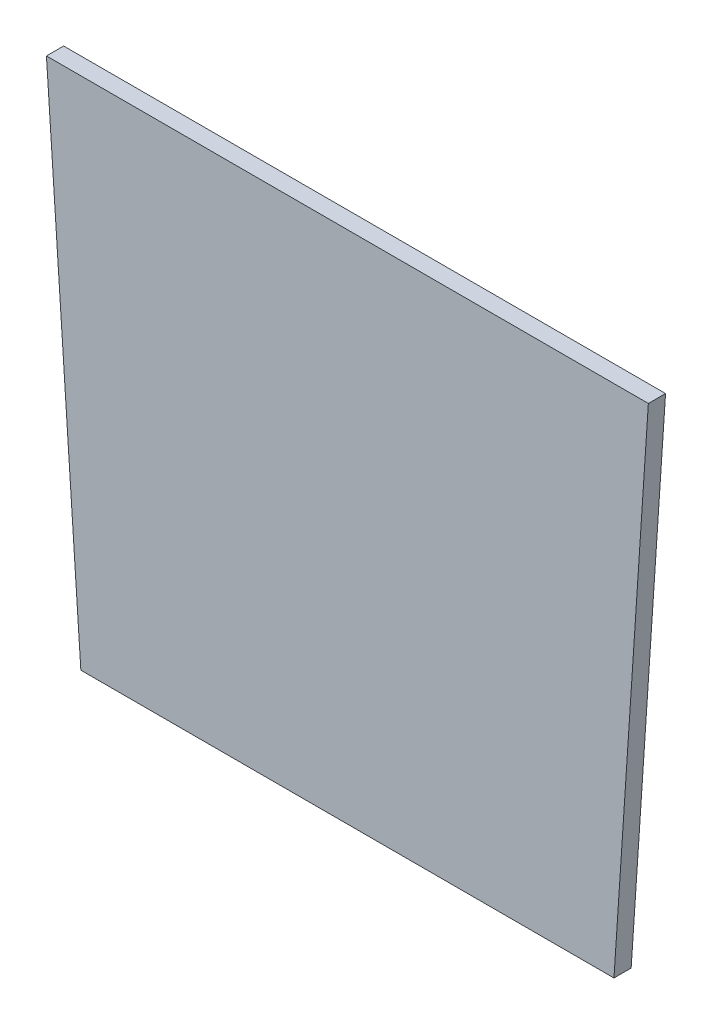
ISO-10303-21;
HEADER;
FILE_DESCRIPTION(('STEP AP214'),'2;1');
FILE_NAME('part.step','',(''),(''),'','','');
FILE_SCHEMA(('AUTOMOTIVE_DESIGN { 1 0 10303 214 1 1 1 1 }'));
ENDSEC;
DATA;
#1=APPLICATION_CONTEXT('core data for automotive mechanical design processes');
#2=APPLICATION_PROTOCOL_DEFINITION('international standard','automotive_design',2000,#1);
#3=PRODUCT_CONTEXT('',#1,'mechanical');
#4=PRODUCT('Part','Part','',(#3));
#5=PRODUCT_RELATED_PRODUCT_CATEGORY('part','',(#4));
#6=PRODUCT_DEFINITION_FORMATION('','',#4);
#7=PRODUCT_DEFINITION_CONTEXT('part definition',#1,'design');
#8=PRODUCT_DEFINITION('design','',#6,#7);
#9=PRODUCT_DEFINITION_SHAPE('','',#8);
#10=(LENGTH_UNIT() NAMED_UNIT(*) SI_UNIT(.MILLI.,.METRE.));
#11=(NAMED_UNIT(*) PLANE_ANGLE_UNIT() SI_UNIT($,.RADIAN.));
#12=(NAMED_UNIT(*) SI_UNIT($,.STERADIAN.) SOLID_ANGLE_UNIT());
#13=UNCERTAINTY_MEASURE_WITH_UNIT(LENGTH_MEASURE(1.E-05),#10,'distance_accuracy_value','');
#14=(GEOMETRIC_REPRESENTATION_CONTEXT(3) GLOBAL_UNCERTAINTY_ASSIGNED_CONTEXT((#13)) GLOBAL_UNIT_ASSIGNED_CONTEXT((#10,
#11,#12)) REPRESENTATION_CONTEXT('',''));
#15=CARTESIAN_POINT('',(0.,0.,0.));
#16=DIRECTION('',(0.,0.,1.));
#17=DIRECTION('',(1.,0.,0.));
#18=AXIS2_PLACEMENT_3D('',#15,#16,#17);
#19=CARTESIAN_POINT('',(-155.,-149.666295470958,10.));
#20=DIRECTION('',(0.997775303139718,0.0666666666666666,0.));
#21=DIRECTION('',(-0.0666666666666666,0.997775303139718,0.));
#22=AXIS2_PLACEMENT_3D('',#19,#20,#21);
#23=PLANE('',#22);
#24=DIRECTION('',(0.0666666666666666,-0.997775303139718,0.));
#25=VECTOR('',#24,1.);
#26=CARTESIAN_POINT('',(-155.,-149.666295470958,0.));
#27=LINE('',#26,#25);
#28=CARTESIAN_POINT('',(-175.,149.666295470958,0.));
#29=VERTEX_POINT('',#28);
#30=CARTESIAN_POINT('',(-155.,-149.666295470958,0.));
#31=VERTEX_POINT('',#30);
#32=EDGE_CURVE('E122',#29,#31,#27,.T.);
#33=ORIENTED_EDGE('',*,*,#32,.T.);
#34=DIRECTION('',(0.,0.,-1.));
#35=VECTOR('',#34,1.);
#36=CARTESIAN_POINT('',(-155.,-149.666295470958,10.));
#37=LINE('',#36,#35);
#38=CARTESIAN_POINT('',(-155.,-149.666295470958,10.));
#39=VERTEX_POINT('',#38);
#40=EDGE_CURVE('E11',#39,#31,#37,.T.);
#41=ORIENTED_EDGE('',*,*,#40,.F.);
#42=DIRECTION('',(0.0666666666666666,-0.997775303139718,0.));
#43=VECTOR('',#42,1.);
#44=CARTESIAN_POINT('',(-155.,-149.666295470958,10.));
#45=LINE('',#44,#43);
#46=CARTESIAN_POINT('',(-175.,149.666295470958,10.));
#47=VERTEX_POINT('',#46);
#48=EDGE_CURVE('E105',#47,#39,#45,.T.);
#49=ORIENTED_EDGE('',*,*,#48,.F.);
#50=DIRECTION('',(0.,0.,-1.));
#51=VECTOR('',#50,1.);
#52=CARTESIAN_POINT('',(-175.,149.666295470958,10.));
#53=LINE('',#52,#51);
#54=EDGE_CURVE('E118',#47,#29,#53,.T.);
#55=ORIENTED_EDGE('',*,*,#54,.T.);
#56=EDGE_LOOP('',(#33,#41,#49,#55));
#57=FACE_BOUND('',#56,.T.);
#58=ADVANCED_FACE('F47',(#57),#23,.F.);
#59=CARTESIAN_POINT('',(155.,-149.666295470958,10.));
#60=DIRECTION('',(0.,1.,0.));
#61=DIRECTION('',(0.,0.,1.));
#62=AXIS2_PLACEMENT_3D('',#59,#60,#61);
#63=PLANE('',#62);
#64=DIRECTION('',(1.,0.,0.));
#65=VECTOR('',#64,1.);
#66=CARTESIAN_POINT('',(155.,-149.666295470958,0.));
#67=LINE('',#66,#65);
#68=CARTESIAN_POINT('',(155.,-149.666295470958,0.));
#69=VERTEX_POINT('',#68);
#70=EDGE_CURVE('E110',#31,#69,#67,.T.);
#71=ORIENTED_EDGE('',*,*,#70,.T.);
#72=DIRECTION('',(0.,0.,-1.));
#73=VECTOR('',#72,1.);
#74=CARTESIAN_POINT('',(155.,-149.666295470958,10.));
#75=LINE('',#74,#73);
#76=CARTESIAN_POINT('',(155.,-149.666295470958,10.));
#77=VERTEX_POINT('',#76);
#78=EDGE_CURVE('E56',#77,#69,#75,.T.);
#79=ORIENTED_EDGE('',*,*,#78,.F.);
#80=DIRECTION('',(1.,0.,0.));
#81=VECTOR('',#80,1.);
#82=CARTESIAN_POINT('',(155.,-149.666295470958,10.));
#83=LINE('',#82,#81);
#84=EDGE_CURVE('E99',#39,#77,#83,.T.);
#85=ORIENTED_EDGE('',*,*,#84,.F.);
#86=ORIENTED_EDGE('',*,*,#40,.T.);
#87=EDGE_LOOP('',(#71,#79,#85,#86));
#88=FACE_BOUND('',#87,.T.);
#89=ADVANCED_FACE('F109',(#88),#63,.F.);
#90=CARTESIAN_POINT('',(175.,149.666295470958,10.));
#91=DIRECTION('',(-0.997775303139718,0.0666666666666666,0.));
#92=DIRECTION('',(-0.0666666666666666,-0.997775303139718,0.));
#93=AXIS2_PLACEMENT_3D('',#90,#91,#92);
#94=PLANE('',#93);
#95=DIRECTION('',(0.0666666666666666,0.997775303139718,0.));
#96=VECTOR('',#95,1.);
#97=CARTESIAN_POINT('',(175.,149.666295470958,0.));
#98=LINE('',#97,#96);
#99=CARTESIAN_POINT('',(175.,149.666295470958,0.));
#100=VERTEX_POINT('',#99);
#101=EDGE_CURVE('E85',#69,#100,#98,.T.);
#102=ORIENTED_EDGE('',*,*,#101,.T.);
#103=DIRECTION('',(0.,0.,-1.));
#104=VECTOR('',#103,1.);
#105=CARTESIAN_POINT('',(175.,149.666295470958,10.));
#106=LINE('',#105,#104);
#107=CARTESIAN_POINT('',(175.,149.666295470958,10.));
#108=VERTEX_POINT('',#107);
#109=EDGE_CURVE('E112',#108,#100,#106,.T.);
#110=ORIENTED_EDGE('',*,*,#109,.F.);
#111=DIRECTION('',(0.0666666666666666,0.997775303139718,0.));
#112=VECTOR('',#111,1.);
#113=CARTESIAN_POINT('',(175.,149.666295470958,10.));
#114=LINE('',#113,#112);
#115=EDGE_CURVE('E103',#77,#108,#114,.T.);
#116=ORIENTED_EDGE('',*,*,#115,.F.);
#117=ORIENTED_EDGE('',*,*,#78,.T.);
#118=EDGE_LOOP('',(#102,#110,#116,#117));
#119=FACE_BOUND('',#118,.T.);
#120=ADVANCED_FACE('F113',(#119),#94,.F.);
#121=CARTESIAN_POINT('',(-175.,149.666295470958,10.));
#122=DIRECTION('',(0.,-1.,0.));
#123=DIRECTION('',(0.,0.,-1.));
#124=AXIS2_PLACEMENT_3D('',#121,#122,#123);
#125=PLANE('',#124);
#126=DIRECTION('',(-1.,0.,0.));
#127=VECTOR('',#126,1.);
#128=CARTESIAN_POINT('',(-175.,149.666295470958,0.));
#129=LINE('',#128,#127);
#130=EDGE_CURVE('E91',#100,#29,#129,.T.);
#131=ORIENTED_EDGE('',*,*,#130,.T.);
#132=ORIENTED_EDGE('',*,*,#54,.F.);
#133=DIRECTION('',(-1.,0.,0.));
#134=VECTOR('',#133,1.);
#135=CARTESIAN_POINT('',(-175.,149.666295470958,10.));
#136=LINE('',#135,#134);
#137=EDGE_CURVE('E67',#108,#47,#136,.T.);
#138=ORIENTED_EDGE('',*,*,#137,.F.);
#139=ORIENTED_EDGE('',*,*,#109,.T.);
#140=EDGE_LOOP('',(#131,#132,#138,#139));
#141=FACE_BOUND('',#140,.T.);
#142=ADVANCED_FACE('F133',(#141),#125,.F.);
#143=CARTESIAN_POINT('',(0.,0.,10.));
#144=DIRECTION('',(0.,0.,-1.));
#145=DIRECTION('',(-1.,0.,0.));
#146=AXIS2_PLACEMENT_3D('',#143,#144,#145);
#147=PLANE('',#146);
#148=ORIENTED_EDGE('',*,*,#48,.T.);
#149=ORIENTED_EDGE('',*,*,#84,.T.);
#150=ORIENTED_EDGE('',*,*,#115,.T.);
#151=ORIENTED_EDGE('',*,*,#137,.T.);
#152=EDGE_LOOP('',(#148,#149,#150,#151));
#153=FACE_BOUND('',#152,.T.);
#154=ADVANCED_FACE('F101',(#153),#147,.F.);
#155=CARTESIAN_POINT('',(0.,0.,0.));
#156=DIRECTION('',(0.,0.,-1.));
#157=DIRECTION('',(-1.,0.,0.));
#158=AXIS2_PLACEMENT_3D('',#155,#156,#157);
#159=PLANE('',#158);
#160=ORIENTED_EDGE('',*,*,#32,.F.);
#161=ORIENTED_EDGE('',*,*,#130,.F.);
#162=ORIENTED_EDGE('',*,*,#101,.F.);
#163=ORIENTED_EDGE('',*,*,#70,.F.);
#164=EDGE_LOOP('',(#160,#161,#162,#163));
#165=FACE_BOUND('',#164,.T.);
#166=ADVANCED_FACE('F136',(#165),#159,.T.);
#167=CLOSED_SHELL('',(#58,#89,#120,#142,#154,#166));
#168=MANIFOLD_SOLID_BREP('B2',#167);
#169=ADVANCED_BREP_SHAPE_REPRESENTATION('',(#18,#168),#14);
#170=SHAPE_DEFINITION_REPRESENTATION(#9,#169);
ENDSEC;
END-ISO-10303-21;
